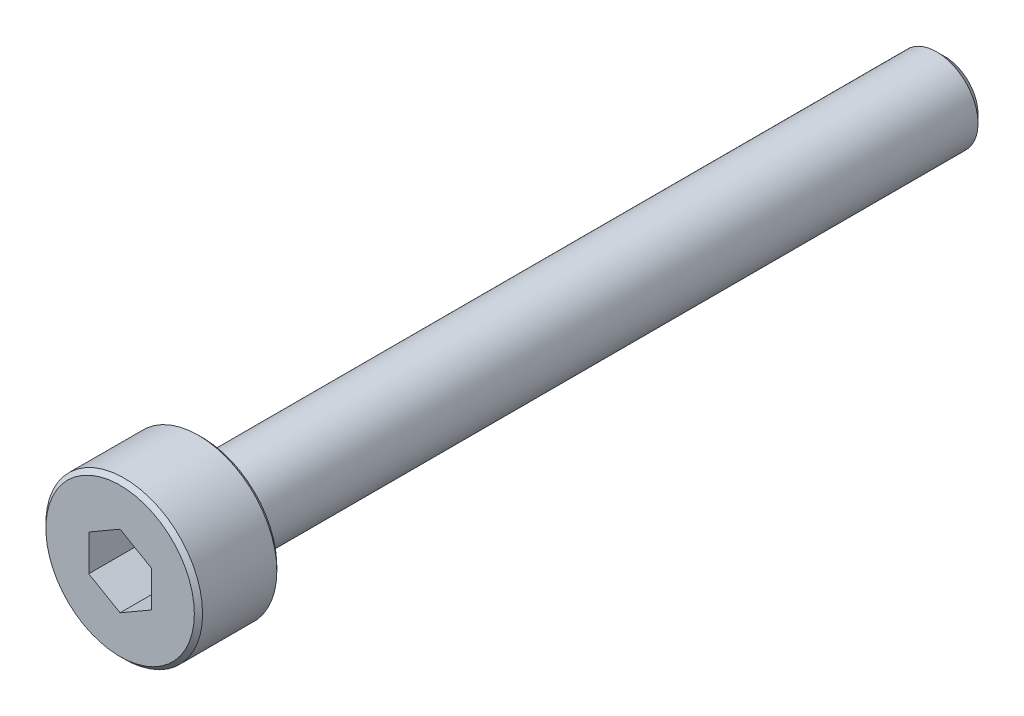
ISO-10303-21;
HEADER;
FILE_DESCRIPTION(('STEP AP214'),'2;1');
FILE_NAME('part.step','',(''),(''),'','','');
FILE_SCHEMA(('AUTOMOTIVE_DESIGN { 1 0 10303 214 1 1 1 1 }'));
ENDSEC;
DATA;
#1=APPLICATION_CONTEXT('core data for automotive mechanical design processes');
#2=APPLICATION_PROTOCOL_DEFINITION('international standard','automotive_design',2000,#1);
#3=PRODUCT_CONTEXT('',#1,'mechanical');
#4=PRODUCT('Part','Part','',(#3));
#5=PRODUCT_RELATED_PRODUCT_CATEGORY('part','',(#4));
#6=PRODUCT_DEFINITION_FORMATION('','',#4);
#7=PRODUCT_DEFINITION_CONTEXT('part definition',#1,'design');
#8=PRODUCT_DEFINITION('design','',#6,#7);
#9=PRODUCT_DEFINITION_SHAPE('','',#8);
#10=(LENGTH_UNIT() NAMED_UNIT(*) SI_UNIT(.MILLI.,.METRE.));
#11=(NAMED_UNIT(*) PLANE_ANGLE_UNIT() SI_UNIT($,.RADIAN.));
#12=(NAMED_UNIT(*) SI_UNIT($,.STERADIAN.) SOLID_ANGLE_UNIT());
#13=UNCERTAINTY_MEASURE_WITH_UNIT(LENGTH_MEASURE(1.E-05),#10,'distance_accuracy_value','');
#14=(GEOMETRIC_REPRESENTATION_CONTEXT(3) GLOBAL_UNCERTAINTY_ASSIGNED_CONTEXT((#13)) GLOBAL_UNIT_ASSIGNED_CONTEXT((#10,
#11,#12)) REPRESENTATION_CONTEXT('',''));
#15=CARTESIAN_POINT('',(0.,0.,0.));
#16=DIRECTION('',(0.,0.,1.));
#17=DIRECTION('',(1.,0.,0.));
#18=AXIS2_PLACEMENT_3D('',#15,#16,#17);
#19=CARTESIAN_POINT('',(0.,0.,10.));
#20=DIRECTION('',(0.,0.,1.));
#21=DIRECTION('',(1.,0.,0.));
#22=AXIS2_PLACEMENT_3D('',#19,#20,#21);
#23=CYLINDRICAL_SURFACE('',#22,1.9);
#24=CARTESIAN_POINT('',(0.,0.,10.1000007633703));
#25=DIRECTION('',(0.,0.,-1.));
#26=DIRECTION('',(-1.,0.,0.));
#27=AXIS2_PLACEMENT_3D('',#24,#25,#26);
#28=CIRCLE('',#27,1.9);
#29=CARTESIAN_POINT('',(-1.9,0.,10.1000007633703));
#30=VERTEX_POINT('',#29);
#31=EDGE_CURVE('E153',#30,#30,#28,.F.);
#32=ORIENTED_EDGE('',*,*,#31,.T.);
#33=EDGE_LOOP('',(#32));
#34=FACE_BOUND('',#33,.T.);
#35=CARTESIAN_POINT('',(0.,0.,11.8999991776262));
#36=DIRECTION('',(0.,0.,1.));
#37=DIRECTION('',(1.,0.,0.));
#38=AXIS2_PLACEMENT_3D('',#35,#36,#37);
#39=CIRCLE('',#38,1.9);
#40=CARTESIAN_POINT('',(1.9,0.,11.8999991776262));
#41=VERTEX_POINT('',#40);
#42=EDGE_CURVE('E150',#41,#41,#39,.F.);
#43=ORIENTED_EDGE('',*,*,#42,.T.);
#44=EDGE_LOOP('',(#43));
#45=FACE_BOUND('',#44,.T.);
#46=ADVANCED_FACE('F39',(#34,#45),#23,.T.);
#47=CARTESIAN_POINT('',(1.9,0.,10.));
#48=DIRECTION('',(0.,0.,-1.));
#49=DIRECTION('',(-1.,0.,0.));
#50=AXIS2_PLACEMENT_3D('',#47,#48,#49);
#51=PLANE('',#50);
#52=CARTESIAN_POINT('',(0.,0.,10.));
#53=DIRECTION('',(0.,0.,-1.));
#54=DIRECTION('',(-1.,0.,0.));
#55=AXIS2_PLACEMENT_3D('',#52,#53,#54);
#56=CIRCLE('',#55,1.79999917762621);
#57=CARTESIAN_POINT('',(-1.79999917762621,0.,10.));
#58=VERTEX_POINT('',#57);
#59=EDGE_CURVE('E156',#58,#58,#56,.T.);
#60=ORIENTED_EDGE('',*,*,#59,.T.);
#61=EDGE_LOOP('',(#60));
#62=FACE_BOUND('',#61,.T.);
#63=CARTESIAN_POINT('',(0.,0.,10.));
#64=DIRECTION('',(0.,0.,-1.));
#65=DIRECTION('',(-1.,0.,0.));
#66=AXIS2_PLACEMENT_3D('',#63,#64,#65);
#67=CIRCLE('',#66,1.);
#68=CARTESIAN_POINT('',(-1.,0.,10.));
#69=VERTEX_POINT('',#68);
#70=EDGE_CURVE('E142',#69,#69,#67,.T.);
#71=ORIENTED_EDGE('',*,*,#70,.F.);
#72=EDGE_LOOP('',(#71));
#73=FACE_BOUND('',#72,.T.);
#74=ADVANCED_FACE('F176',(#62,#73),#51,.T.);
#75=CARTESIAN_POINT('',(0.,0.,12.));
#76=DIRECTION('',(0.,0.,1.));
#77=DIRECTION('',(1.,0.,0.));
#78=AXIS2_PLACEMENT_3D('',#75,#76,#77);
#79=PLANE('',#78);
#80=CARTESIAN_POINT('',(0.,0.,12.));
#81=DIRECTION('',(0.,0.,1.));
#82=DIRECTION('',(1.,0.,0.));
#83=AXIS2_PLACEMENT_3D('',#80,#81,#82);
#84=CIRCLE('',#83,1.79999923662968);
#85=CARTESIAN_POINT('',(1.79999923662968,0.,12.));
#86=VERTEX_POINT('',#85);
#87=EDGE_CURVE('E159',#86,#86,#84,.T.);
#88=ORIENTED_EDGE('',*,*,#87,.T.);
#89=EDGE_LOOP('',(#88));
#90=FACE_BOUND('',#89,.T.);
#91=DIRECTION('',(0.,-1.,0.));
#92=VECTOR('',#91,1.);
#93=CARTESIAN_POINT('',(-0.759999999999996,0.438786204584093,12.));
#94=LINE('',#93,#92);
#95=CARTESIAN_POINT('',(-0.759999999999996,0.438786204584093,12.));
#96=VERTEX_POINT('',#95);
#97=CARTESIAN_POINT('',(-0.76,-0.4387862045841,12.));
#98=VERTEX_POINT('',#97);
#99=EDGE_CURVE('E55',#96,#98,#94,.T.);
#100=ORIENTED_EDGE('',*,*,#99,.F.);
#101=DIRECTION('',(-0.866025403784438,-0.500000000000002,0.));
#102=VECTOR('',#101,1.);
#103=CARTESIAN_POINT('',(0.,0.877572409168213,12.));
#104=LINE('',#103,#102);
#105=CARTESIAN_POINT('',(0.,0.877572409168213,12.));
#106=VERTEX_POINT('',#105);
#107=EDGE_CURVE('E138',#106,#96,#104,.T.);
#108=ORIENTED_EDGE('',*,*,#107,.F.);
#109=DIRECTION('',(-0.866025403784438,0.500000000000002,0.));
#110=VECTOR('',#109,1.);
#111=CARTESIAN_POINT('',(0.76,0.4387862045841,12.));
#112=LINE('',#111,#110);
#113=CARTESIAN_POINT('',(0.76,0.4387862045841,12.));
#114=VERTEX_POINT('',#113);
#115=EDGE_CURVE('E136',#114,#106,#112,.T.);
#116=ORIENTED_EDGE('',*,*,#115,.F.);
#117=DIRECTION('',(0.,1.,0.));
#118=VECTOR('',#117,1.);
#119=CARTESIAN_POINT('',(0.759999999999996,-0.438786204584093,12.));
#120=LINE('',#119,#118);
#121=CARTESIAN_POINT('',(0.759999999999996,-0.438786204584093,12.));
#122=VERTEX_POINT('',#121);
#123=EDGE_CURVE('E103',#122,#114,#120,.T.);
#124=ORIENTED_EDGE('',*,*,#123,.F.);
#125=DIRECTION('',(0.86602540378444,0.499999999999998,0.));
#126=VECTOR('',#125,1.);
#127=CARTESIAN_POINT('',(0.,-0.877572409168207,12.));
#128=LINE('',#127,#126);
#129=CARTESIAN_POINT('',(0.,-0.877572409168207,12.));
#130=VERTEX_POINT('',#129);
#131=EDGE_CURVE('E132',#130,#122,#128,.T.);
#132=ORIENTED_EDGE('',*,*,#131,.F.);
#133=DIRECTION('',(0.866025403784442,-0.499999999999994,0.));
#134=VECTOR('',#133,1.);
#135=CARTESIAN_POINT('',(-0.76,-0.4387862045841,12.));
#136=LINE('',#135,#134);
#137=EDGE_CURVE('E129',#98,#130,#136,.T.);
#138=ORIENTED_EDGE('',*,*,#137,.F.);
#139=EDGE_LOOP('',(#100,#108,#116,#124,#132,#138));
#140=FACE_BOUND('',#139,.T.);
#141=ADVANCED_FACE('F182',(#90,#140),#79,.T.);
#142=CARTESIAN_POINT('',(0.,0.,-8.));
#143=DIRECTION('',(0.,0.,1.));
#144=DIRECTION('',(1.,0.,0.));
#145=AXIS2_PLACEMENT_3D('',#142,#143,#144);
#146=CYLINDRICAL_SURFACE('',#145,1.);
#147=CARTESIAN_POINT('',(0.,0.,-7.79998954454023));
#148=DIRECTION('',(0.,0.,-1.));
#149=DIRECTION('',(-1.,0.,0.));
#150=AXIS2_PLACEMENT_3D('',#147,#148,#149);
#151=CIRCLE('',#150,1.);
#152=CARTESIAN_POINT('',(-1.,0.,-7.79998954454023));
#153=VERTEX_POINT('',#152);
#154=EDGE_CURVE('E11',#153,#153,#151,.F.);
#155=ORIENTED_EDGE('',*,*,#154,.T.);
#156=EDGE_LOOP('',(#155));
#157=FACE_BOUND('',#156,.T.);
#158=ORIENTED_EDGE('',*,*,#70,.T.);
#159=EDGE_LOOP('',(#158));
#160=FACE_BOUND('',#159,.T.);
#161=ADVANCED_FACE('F209',(#157,#160),#146,.T.);
#162=CARTESIAN_POINT('',(0.,0.,-8.));
#163=DIRECTION('',(0.,0.,-1.));
#164=DIRECTION('',(-1.,0.,0.));
#165=AXIS2_PLACEMENT_3D('',#162,#163,#164);
#166=PLANE('',#165);
#167=CARTESIAN_POINT('',(0.,0.,-8.));
#168=DIRECTION('',(0.,0.,-1.));
#169=DIRECTION('',(-1.,0.,0.));
#170=AXIS2_PLACEMENT_3D('',#167,#168,#169);
#171=CIRCLE('',#170,0.799991635727207);
#172=CARTESIAN_POINT('',(-0.799991635727207,0.,-8.));
#173=VERTEX_POINT('',#172);
#174=EDGE_CURVE('E48',#173,#173,#171,.T.);
#175=ORIENTED_EDGE('',*,*,#174,.T.);
#176=EDGE_LOOP('',(#175));
#177=FACE_BOUND('',#176,.T.);
#178=ADVANCED_FACE('F164',(#177),#166,.T.);
#179=CARTESIAN_POINT('',(-0.759999999999996,0.438786204584093,10.5));
#180=DIRECTION('',(-1.,0.,0.));
#181=DIRECTION('',(0.,-1.,0.));
#182=AXIS2_PLACEMENT_3D('',#179,#180,#181);
#183=PLANE('',#182);
#184=ORIENTED_EDGE('',*,*,#99,.T.);
#185=DIRECTION('',(0.,0.,1.));
#186=VECTOR('',#185,1.);
#187=CARTESIAN_POINT('',(-0.76,-0.4387862045841,10.5));
#188=LINE('',#187,#186);
#189=CARTESIAN_POINT('',(-0.76,-0.4387862045841,10.5));
#190=VERTEX_POINT('',#189);
#191=EDGE_CURVE('E85',#190,#98,#188,.T.);
#192=ORIENTED_EDGE('',*,*,#191,.F.);
#193=DIRECTION('',(0.,-1.,0.));
#194=VECTOR('',#193,1.);
#195=CARTESIAN_POINT('',(-0.759999999999996,0.438786204584093,10.5));
#196=LINE('',#195,#194);
#197=CARTESIAN_POINT('',(-0.759999999999996,0.438786204584093,10.5));
#198=VERTEX_POINT('',#197);
#199=EDGE_CURVE('E140',#198,#190,#196,.T.);
#200=ORIENTED_EDGE('',*,*,#199,.F.);
#201=DIRECTION('',(0.,0.,1.));
#202=VECTOR('',#201,1.);
#203=CARTESIAN_POINT('',(-0.759999999999996,0.438786204584093,10.5));
#204=LINE('',#203,#202);
#205=EDGE_CURVE('E63',#198,#96,#204,.T.);
#206=ORIENTED_EDGE('',*,*,#205,.T.);
#207=EDGE_LOOP('',(#184,#192,#200,#206));
#208=FACE_BOUND('',#207,.T.);
#209=ADVANCED_FACE('F217',(#208),#183,.F.);
#210=CARTESIAN_POINT('',(0.,0.877572409168213,10.5));
#211=DIRECTION('',(-0.500000000000002,0.866025403784438,0.));
#212=DIRECTION('',(-0.866025403784438,-0.500000000000002,0.));
#213=AXIS2_PLACEMENT_3D('',#210,#211,#212);
#214=PLANE('',#213);
#215=ORIENTED_EDGE('',*,*,#107,.T.);
#216=ORIENTED_EDGE('',*,*,#205,.F.);
#217=DIRECTION('',(-0.866025403784438,-0.500000000000002,0.));
#218=VECTOR('',#217,1.);
#219=CARTESIAN_POINT('',(0.,0.877572409168213,10.5));
#220=LINE('',#219,#218);
#221=CARTESIAN_POINT('',(0.,0.877572409168213,10.5));
#222=VERTEX_POINT('',#221);
#223=EDGE_CURVE('E115',#222,#198,#220,.T.);
#224=ORIENTED_EDGE('',*,*,#223,.F.);
#225=DIRECTION('',(0.,0.,1.));
#226=VECTOR('',#225,1.);
#227=CARTESIAN_POINT('',(0.,0.877572409168213,10.5));
#228=LINE('',#227,#226);
#229=EDGE_CURVE('E107',#222,#106,#228,.T.);
#230=ORIENTED_EDGE('',*,*,#229,.T.);
#231=EDGE_LOOP('',(#215,#216,#224,#230));
#232=FACE_BOUND('',#231,.T.);
#233=ADVANCED_FACE('F223',(#232),#214,.F.);
#234=CARTESIAN_POINT('',(0.76,0.4387862045841,10.5));
#235=DIRECTION('',(0.500000000000002,0.866025403784438,0.));
#236=DIRECTION('',(-0.866025403784438,0.500000000000002,0.));
#237=AXIS2_PLACEMENT_3D('',#234,#235,#236);
#238=PLANE('',#237);
#239=ORIENTED_EDGE('',*,*,#115,.T.);
#240=ORIENTED_EDGE('',*,*,#229,.F.);
#241=DIRECTION('',(-0.866025403784438,0.500000000000002,0.));
#242=VECTOR('',#241,1.);
#243=CARTESIAN_POINT('',(0.76,0.4387862045841,10.5));
#244=LINE('',#243,#242);
#245=CARTESIAN_POINT('',(0.76,0.4387862045841,10.5));
#246=VERTEX_POINT('',#245);
#247=EDGE_CURVE('E111',#246,#222,#244,.T.);
#248=ORIENTED_EDGE('',*,*,#247,.F.);
#249=DIRECTION('',(0.,0.,1.));
#250=VECTOR('',#249,1.);
#251=CARTESIAN_POINT('',(0.76,0.4387862045841,10.5));
#252=LINE('',#251,#250);
#253=EDGE_CURVE('E96',#246,#114,#252,.T.);
#254=ORIENTED_EDGE('',*,*,#253,.T.);
#255=EDGE_LOOP('',(#239,#240,#248,#254));
#256=FACE_BOUND('',#255,.T.);
#257=ADVANCED_FACE('F112',(#256),#238,.F.);
#258=CARTESIAN_POINT('',(0.759999999999996,-0.438786204584093,10.5));
#259=DIRECTION('',(1.,0.,0.));
#260=DIRECTION('',(0.,1.,0.));
#261=AXIS2_PLACEMENT_3D('',#258,#259,#260);
#262=PLANE('',#261);
#263=ORIENTED_EDGE('',*,*,#123,.T.);
#264=ORIENTED_EDGE('',*,*,#253,.F.);
#265=DIRECTION('',(0.,1.,0.));
#266=VECTOR('',#265,1.);
#267=CARTESIAN_POINT('',(0.759999999999996,-0.438786204584093,10.5));
#268=LINE('',#267,#266);
#269=CARTESIAN_POINT('',(0.759999999999996,-0.438786204584093,10.5));
#270=VERTEX_POINT('',#269);
#271=EDGE_CURVE('E100',#270,#246,#268,.T.);
#272=ORIENTED_EDGE('',*,*,#271,.F.);
#273=DIRECTION('',(0.,0.,1.));
#274=VECTOR('',#273,1.);
#275=CARTESIAN_POINT('',(0.759999999999996,-0.438786204584093,10.5));
#276=LINE('',#275,#274);
#277=EDGE_CURVE('E108',#270,#122,#276,.T.);
#278=ORIENTED_EDGE('',*,*,#277,.T.);
#279=EDGE_LOOP('',(#263,#264,#272,#278));
#280=FACE_BOUND('',#279,.T.);
#281=ADVANCED_FACE('F98',(#280),#262,.F.);
#282=CARTESIAN_POINT('',(0.,-0.877572409168207,10.5));
#283=DIRECTION('',(0.499999999999998,-0.86602540378444,0.));
#284=DIRECTION('',(0.86602540378444,0.499999999999998,0.));
#285=AXIS2_PLACEMENT_3D('',#282,#283,#284);
#286=PLANE('',#285);
#287=ORIENTED_EDGE('',*,*,#131,.T.);
#288=ORIENTED_EDGE('',*,*,#277,.F.);
#289=DIRECTION('',(0.86602540378444,0.499999999999998,0.));
#290=VECTOR('',#289,1.);
#291=CARTESIAN_POINT('',(0.,-0.877572409168207,10.5));
#292=LINE('',#291,#290);
#293=CARTESIAN_POINT('',(0.,-0.877572409168207,10.5));
#294=VERTEX_POINT('',#293);
#295=EDGE_CURVE('E121',#294,#270,#292,.T.);
#296=ORIENTED_EDGE('',*,*,#295,.F.);
#297=DIRECTION('',(0.,0.,1.));
#298=VECTOR('',#297,1.);
#299=CARTESIAN_POINT('',(0.,-0.877572409168207,10.5));
#300=LINE('',#299,#298);
#301=EDGE_CURVE('E145',#294,#130,#300,.T.);
#302=ORIENTED_EDGE('',*,*,#301,.T.);
#303=EDGE_LOOP('',(#287,#288,#296,#302));
#304=FACE_BOUND('',#303,.T.);
#305=ADVANCED_FACE('F226',(#304),#286,.F.);
#306=CARTESIAN_POINT('',(-0.76,-0.4387862045841,10.5));
#307=DIRECTION('',(-0.499999999999994,-0.866025403784442,0.));
#308=DIRECTION('',(0.866025403784442,-0.499999999999994,0.));
#309=AXIS2_PLACEMENT_3D('',#306,#307,#308);
#310=PLANE('',#309);
#311=ORIENTED_EDGE('',*,*,#137,.T.);
#312=ORIENTED_EDGE('',*,*,#301,.F.);
#313=DIRECTION('',(0.866025403784442,-0.499999999999994,0.));
#314=VECTOR('',#313,1.);
#315=CARTESIAN_POINT('',(-0.76,-0.4387862045841,10.5));
#316=LINE('',#315,#314);
#317=EDGE_CURVE('E123',#190,#294,#316,.T.);
#318=ORIENTED_EDGE('',*,*,#317,.F.);
#319=ORIENTED_EDGE('',*,*,#191,.T.);
#320=EDGE_LOOP('',(#311,#312,#318,#319));
#321=FACE_BOUND('',#320,.T.);
#322=ADVANCED_FACE('F201',(#321),#310,.F.);
#323=CARTESIAN_POINT('',(0.,0.,10.5));
#324=DIRECTION('',(0.,0.,1.));
#325=DIRECTION('',(1.,0.,0.));
#326=AXIS2_PLACEMENT_3D('',#323,#324,#325);
#327=PLANE('',#326);
#328=ORIENTED_EDGE('',*,*,#199,.T.);
#329=ORIENTED_EDGE('',*,*,#317,.T.);
#330=ORIENTED_EDGE('',*,*,#295,.T.);
#331=ORIENTED_EDGE('',*,*,#271,.T.);
#332=ORIENTED_EDGE('',*,*,#247,.T.);
#333=ORIENTED_EDGE('',*,*,#223,.T.);
#334=EDGE_LOOP('',(#328,#329,#330,#331,#332,#333));
#335=FACE_BOUND('',#334,.T.);
#336=ADVANCED_FACE('F118',(#335),#327,.T.);
#337=CARTESIAN_POINT('',(0.,0.,10.1000007633703));
#338=DIRECTION('',(0.,0.,1.));
#339=DIRECTION('',(1.,0.,0.));
#340=AXIS2_PLACEMENT_3D('',#337,#338,#339);
#341=CONICAL_SURFACE('',#340,1.9,0.78539845841245);
#342=ORIENTED_EDGE('',*,*,#59,.F.);
#343=EDGE_LOOP('',(#342));
#344=FACE_BOUND('',#343,.T.);
#345=ORIENTED_EDGE('',*,*,#31,.F.);
#346=EDGE_LOOP('',(#345));
#347=FACE_BOUND('',#346,.T.);
#348=ADVANCED_FACE('F172',(#344,#347),#341,.T.);
#349=CARTESIAN_POINT('',(0.,0.,12.));
#350=DIRECTION('',(0.,0.,-1.));
#351=DIRECTION('',(-1.,0.,0.));
#352=AXIS2_PLACEMENT_3D('',#349,#350,#351);
#353=CONICAL_SURFACE('',#352,1.79999923662968,0.785397868382458);
#354=ORIENTED_EDGE('',*,*,#42,.F.);
#355=EDGE_LOOP('',(#354));
#356=FACE_BOUND('',#355,.T.);
#357=ORIENTED_EDGE('',*,*,#87,.F.);
#358=EDGE_LOOP('',(#357));
#359=FACE_BOUND('',#358,.T.);
#360=ADVANCED_FACE('F167',(#356,#359),#353,.T.);
#361=CARTESIAN_POINT('',(0.,0.,-8.));
#362=DIRECTION('',(0.,0.,1.));
#363=DIRECTION('',(1.,0.,0.));
#364=AXIS2_PLACEMENT_3D('',#361,#362,#363);
#365=CONICAL_SURFACE('',#364,0.799991635727207,0.785392935675982);
#366=ORIENTED_EDGE('',*,*,#154,.F.);
#367=EDGE_LOOP('',(#366));
#368=FACE_BOUND('',#367,.T.);
#369=ORIENTED_EDGE('',*,*,#174,.F.);
#370=EDGE_LOOP('',(#369));
#371=FACE_BOUND('',#370,.T.);
#372=ADVANCED_FACE('F42',(#368,#371),#365,.T.);
#373=CLOSED_SHELL('',(#46,#74,#141,#161,#178,#209,#233,#257,#281,#305,#322,#336,#348,#360,#372));
#374=MANIFOLD_SOLID_BREP('B2',#373);
#375=ADVANCED_BREP_SHAPE_REPRESENTATION('',(#18,#374),#14);
#376=SHAPE_DEFINITION_REPRESENTATION(#9,#375);
ENDSEC;
END-ISO-10303-21;
